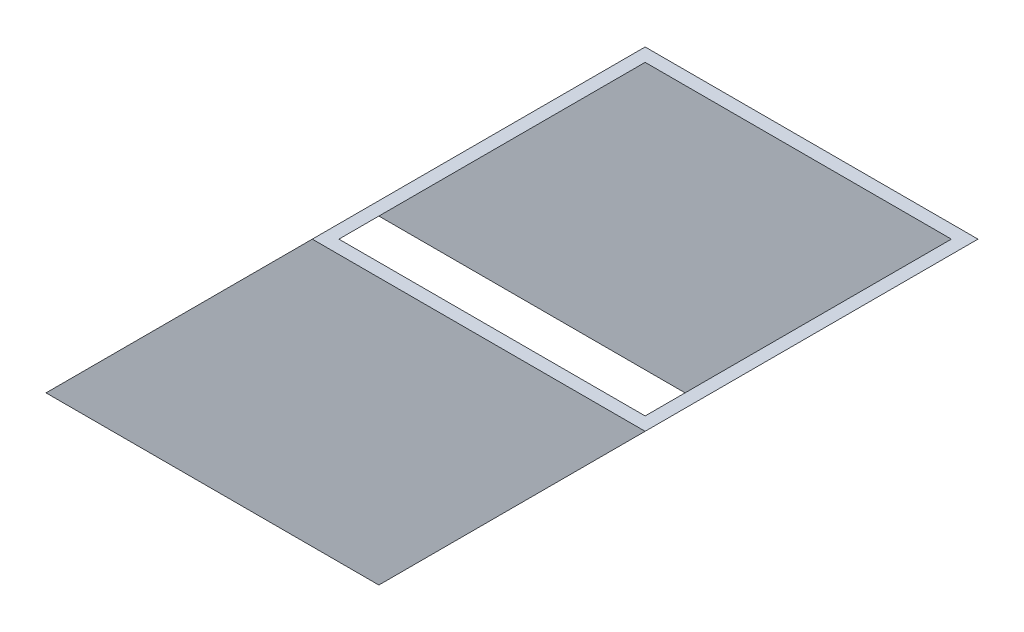
ISO-10303-21;
HEADER;
FILE_DESCRIPTION(('STEP AP214'),'2;1');
FILE_NAME('part.step','',(''),(''),'','','');
FILE_SCHEMA(('AUTOMOTIVE_DESIGN { 1 0 10303 214 1 1 1 1 }'));
ENDSEC;
DATA;
#1=APPLICATION_CONTEXT('core data for automotive mechanical design processes');
#2=APPLICATION_PROTOCOL_DEFINITION('international standard','automotive_design',2000,#1);
#3=PRODUCT_CONTEXT('',#1,'mechanical');
#4=PRODUCT('Part','Part','',(#3));
#5=PRODUCT_RELATED_PRODUCT_CATEGORY('part','',(#4));
#6=PRODUCT_DEFINITION_FORMATION('','',#4);
#7=PRODUCT_DEFINITION_CONTEXT('part definition',#1,'design');
#8=PRODUCT_DEFINITION('design','',#6,#7);
#9=PRODUCT_DEFINITION_SHAPE('','',#8);
#10=(LENGTH_UNIT() NAMED_UNIT(*) SI_UNIT(.MILLI.,.METRE.));
#11=(NAMED_UNIT(*) PLANE_ANGLE_UNIT() SI_UNIT($,.RADIAN.));
#12=(NAMED_UNIT(*) SI_UNIT($,.STERADIAN.) SOLID_ANGLE_UNIT());
#13=UNCERTAINTY_MEASURE_WITH_UNIT(LENGTH_MEASURE(1.E-05),#10,'distance_accuracy_value','');
#14=(GEOMETRIC_REPRESENTATION_CONTEXT(3) GLOBAL_UNCERTAINTY_ASSIGNED_CONTEXT((#13)) GLOBAL_UNIT_ASSIGNED_CONTEXT((#10,
#11,#12)) REPRESENTATION_CONTEXT('',''));
#15=CARTESIAN_POINT('',(0.,0.,0.));
#16=DIRECTION('',(0.,0.,1.));
#17=DIRECTION('',(1.,0.,0.));
#18=AXIS2_PLACEMENT_3D('',#15,#16,#17);
#19=CARTESIAN_POINT('',(0.,0.,0.));
#20=DIRECTION('',(0.,0.,-1.));
#21=DIRECTION('',(-1.,0.,0.));
#22=AXIS2_PLACEMENT_3D('',#19,#20,#21);
#23=PLANE('',#22);
#24=DIRECTION('',(1.,0.,0.));
#25=VECTOR('',#24,1.);
#26=CARTESIAN_POINT('',(-32.3420074349443,-70.3531598513011,0.));
#27=LINE('',#26,#25);
#28=CARTESIAN_POINT('',(-80.3420074349443,-70.3531598513011,0.));
#29=VERTEX_POINT('',#28);
#30=CARTESIAN_POINT('',(-34.3420074349443,-70.3531598513011,0.));
#31=VERTEX_POINT('',#30);
#32=EDGE_CURVE('E213',#29,#31,#27,.T.);
#33=ORIENTED_EDGE('',*,*,#32,.F.);
#34=DIRECTION('',(-0.707106781186551,-0.707106781186544,0.));
#35=VECTOR('',#34,1.);
#36=CARTESIAN_POINT('',(-40.3420074349438,-30.3531598513011,0.));
#37=LINE('',#36,#35);
#38=CARTESIAN_POINT('',(-40.3420074349438,-30.3531598513011,0.));
#39=VERTEX_POINT('',#38);
#40=EDGE_CURVE('E190',#39,#29,#37,.T.);
#41=ORIENTED_EDGE('',*,*,#40,.F.);
#42=DIRECTION('',(-1.,0.,0.));
#43=VECTOR('',#42,1.);
#44=CARTESIAN_POINT('',(-42.3420074349438,-30.3531598513011,0.));
#45=LINE('',#44,#43);
#46=CARTESIAN_POINT('',(5.65799256505616,-30.3531598513011,0.));
#47=VERTEX_POINT('',#46);
#48=EDGE_CURVE('E218',#47,#39,#45,.T.);
#49=ORIENTED_EDGE('',*,*,#48,.F.);
#50=DIRECTION('',(0.707106781186551,0.707106781186544,0.));
#51=VECTOR('',#50,1.);
#52=CARTESIAN_POINT('',(-34.3420074349443,-70.3531598513011,0.));
#53=LINE('',#52,#51);
#54=EDGE_CURVE('E201',#31,#47,#53,.T.);
#55=ORIENTED_EDGE('',*,*,#54,.F.);
#56=EDGE_LOOP('',(#33,#41,#49,#55));
#57=FACE_BOUND('',#56,.T.);
#58=ADVANCED_FACE('F39',(#57),#23,.T.);
#59=CARTESIAN_POINT('',(-82.3420074349443,-70.3531598513011,2.));
#60=DIRECTION('',(0.707106781186544,-0.707106781186551,0.));
#61=DIRECTION('',(0.707106781186551,0.707106781186544,0.));
#62=AXIS2_PLACEMENT_3D('',#59,#60,#61);
#63=PLANE('',#62);
#64=DIRECTION('',(-0.707106781186551,-0.707106781186544,0.));
#65=VECTOR('',#64,1.);
#66=CARTESIAN_POINT('',(-63.0733476476107,-51.0845000639678,-28.));
#67=LINE('',#66,#65);
#68=CARTESIAN_POINT('',(-59.1842603510847,-47.1954127674418,-28.));
#69=VERTEX_POINT('',#68);
#70=CARTESIAN_POINT('',(-63.0733476476107,-51.0845000639678,-28.));
#71=VERTEX_POINT('',#70);
#72=EDGE_CURVE('E143',#69,#71,#67,.T.);
#73=ORIENTED_EDGE('',*,*,#72,.F.);
#74=DIRECTION('',(0.,0.,-1.));
#75=VECTOR('',#74,1.);
#76=CARTESIAN_POINT('',(-59.1842603510847,-47.1954127674418,-28.));
#77=LINE('',#76,#75);
#78=CARTESIAN_POINT('',(-59.1842603510847,-47.1954127674418,-18.));
#79=VERTEX_POINT('',#78);
#80=EDGE_CURVE('E55',#79,#69,#77,.T.);
#81=ORIENTED_EDGE('',*,*,#80,.F.);
#82=DIRECTION('',(0.707106781186551,0.707106781186544,0.));
#83=VECTOR('',#82,1.);
#84=CARTESIAN_POINT('',(-59.1842603510847,-47.1954127674418,-18.));
#85=LINE('',#84,#83);
#86=CARTESIAN_POINT('',(-63.0733476476107,-51.0845000639678,-18.));
#87=VERTEX_POINT('',#86);
#88=EDGE_CURVE('E149',#87,#79,#85,.T.);
#89=ORIENTED_EDGE('',*,*,#88,.F.);
#90=DIRECTION('',(0.,0.,1.));
#91=VECTOR('',#90,1.);
#92=CARTESIAN_POINT('',(-63.0733476476107,-51.0845000639678,-18.));
#93=LINE('',#92,#91);
#94=EDGE_CURVE('E132',#71,#87,#93,.T.);
#95=ORIENTED_EDGE('',*,*,#94,.F.);
#96=EDGE_LOOP('',(#73,#81,#89,#95));
#97=FACE_BOUND('',#96,.T.);
#98=DIRECTION('',(0.,0.,-1.));
#99=VECTOR('',#98,1.);
#100=CARTESIAN_POINT('',(-42.3420074349438,-30.3531598513011,2.));
#101=LINE('',#100,#99);
#102=CARTESIAN_POINT('',(-42.3420074349438,-30.3531598513011,2.));
#103=VERTEX_POINT('',#102);
#104=CARTESIAN_POINT('',(-42.3420074349438,-30.3531598513011,-48.));
#105=VERTEX_POINT('',#104);
#106=EDGE_CURVE('E224',#103,#105,#101,.T.);
#107=ORIENTED_EDGE('',*,*,#106,.T.);
#108=DIRECTION('',(0.707106781186551,0.707106781186544,0.));
#109=VECTOR('',#108,1.);
#110=CARTESIAN_POINT('',(-42.3420074349438,-30.3531598513011,-48.));
#111=LINE('',#110,#109);
#112=CARTESIAN_POINT('',(-82.3420074349443,-70.3531598513011,-48.));
#113=VERTEX_POINT('',#112);
#114=EDGE_CURVE('E184',#113,#105,#111,.T.);
#115=ORIENTED_EDGE('',*,*,#114,.F.);
#116=DIRECTION('',(0.,0.,-1.));
#117=VECTOR('',#116,1.);
#118=CARTESIAN_POINT('',(-82.3420074349443,-70.3531598513011,2.));
#119=LINE('',#118,#117);
#120=CARTESIAN_POINT('',(-82.3420074349443,-70.3531598513011,2.));
#121=VERTEX_POINT('',#120);
#122=EDGE_CURVE('E11',#121,#113,#119,.T.);
#123=ORIENTED_EDGE('',*,*,#122,.F.);
#124=DIRECTION('',(-0.707106781186551,-0.707106781186544,0.));
#125=VECTOR('',#124,1.);
#126=CARTESIAN_POINT('',(-82.3420074349443,-70.3531598513011,2.));
#127=LINE('',#126,#125);
#128=EDGE_CURVE('E214',#103,#121,#127,.T.);
#129=ORIENTED_EDGE('',*,*,#128,.F.);
#130=EDGE_LOOP('',(#107,#115,#123,#129));
#131=FACE_BOUND('',#130,.T.);
#132=ADVANCED_FACE('F41',(#97,#131),#63,.F.);
#133=CARTESIAN_POINT('',(-32.3420074349443,-70.3531598513011,2.));
#134=DIRECTION('',(0.,1.,0.));
#135=DIRECTION('',(0.,0.,1.));
#136=AXIS2_PLACEMENT_3D('',#133,#134,#135);
#137=PLANE('',#136);
#138=DIRECTION('',(0.,0.,1.));
#139=VECTOR('',#138,1.);
#140=CARTESIAN_POINT('',(-34.3420074349443,-70.3531598513011,-46.));
#141=LINE('',#140,#139);
#142=CARTESIAN_POINT('',(-34.3420074349443,-70.3531598513011,-46.));
#143=VERTEX_POINT('',#142);
#144=EDGE_CURVE('E205',#143,#31,#141,.T.);
#145=ORIENTED_EDGE('',*,*,#144,.F.);
#146=DIRECTION('',(-1.,0.,0.));
#147=VECTOR('',#146,1.);
#148=CARTESIAN_POINT('',(-82.3420074349443,-70.3531598513011,-46.));
#149=LINE('',#148,#147);
#150=CARTESIAN_POINT('',(-80.3420074349443,-70.3531598513011,-46.));
#151=VERTEX_POINT('',#150);
#152=EDGE_CURVE('E174',#143,#151,#149,.T.);
#153=ORIENTED_EDGE('',*,*,#152,.T.);
#154=DIRECTION('',(0.,0.,1.));
#155=VECTOR('',#154,1.);
#156=CARTESIAN_POINT('',(-80.3420074349443,-70.3531598513011,-46.));
#157=LINE('',#156,#155);
#158=EDGE_CURVE('E63',#151,#29,#157,.T.);
#159=ORIENTED_EDGE('',*,*,#158,.T.);
#160=ORIENTED_EDGE('',*,*,#32,.T.);
#161=EDGE_LOOP('',(#145,#153,#159,#160));
#162=FACE_BOUND('',#161,.T.);
#163=ORIENTED_EDGE('',*,*,#122,.T.);
#164=DIRECTION('',(-1.,0.,0.));
#165=VECTOR('',#164,1.);
#166=CARTESIAN_POINT('',(-82.3420074349443,-70.3531598513011,-48.));
#167=LINE('',#166,#165);
#168=CARTESIAN_POINT('',(-32.3420074349443,-70.3531598513011,-48.));
#169=VERTEX_POINT('',#168);
#170=EDGE_CURVE('E180',#169,#113,#167,.T.);
#171=ORIENTED_EDGE('',*,*,#170,.F.);
#172=DIRECTION('',(0.,0.,-1.));
#173=VECTOR('',#172,1.);
#174=CARTESIAN_POINT('',(-32.3420074349443,-70.3531598513011,2.));
#175=LINE('',#174,#173);
#176=CARTESIAN_POINT('',(-32.3420074349443,-70.3531598513011,2.));
#177=VERTEX_POINT('',#176);
#178=EDGE_CURVE('E48',#177,#169,#175,.T.);
#179=ORIENTED_EDGE('',*,*,#178,.F.);
#180=DIRECTION('',(1.,0.,0.));
#181=VECTOR('',#180,1.);
#182=CARTESIAN_POINT('',(-32.3420074349443,-70.3531598513011,2.));
#183=LINE('',#182,#181);
#184=EDGE_CURVE('E217',#121,#177,#183,.T.);
#185=ORIENTED_EDGE('',*,*,#184,.F.);
#186=EDGE_LOOP('',(#163,#171,#179,#185));
#187=FACE_BOUND('',#186,.T.);
#188=ADVANCED_FACE('F239',(#162,#187),#137,.F.);
#189=CARTESIAN_POINT('',(7.65799256505616,-30.3531598513011,2.));
#190=DIRECTION('',(-0.707106781186544,0.707106781186551,0.));
#191=DIRECTION('',(-0.707106781186551,-0.707106781186544,0.));
#192=AXIS2_PLACEMENT_3D('',#189,#190,#191);
#193=PLANE('',#192);
#194=ORIENTED_EDGE('',*,*,#178,.T.);
#195=DIRECTION('',(-0.707106781186551,-0.707106781186544,0.));
#196=VECTOR('',#195,1.);
#197=CARTESIAN_POINT('',(-32.3420074349443,-70.3531598513011,-48.));
#198=LINE('',#197,#196);
#199=CARTESIAN_POINT('',(7.65799256505616,-30.3531598513011,-48.));
#200=VERTEX_POINT('',#199);
#201=EDGE_CURVE('E177',#200,#169,#198,.T.);
#202=ORIENTED_EDGE('',*,*,#201,.F.);
#203=DIRECTION('',(0.,0.,-1.));
#204=VECTOR('',#203,1.);
#205=CARTESIAN_POINT('',(7.65799256505616,-30.3531598513011,2.));
#206=LINE('',#205,#204);
#207=CARTESIAN_POINT('',(7.65799256505616,-30.3531598513011,2.));
#208=VERTEX_POINT('',#207);
#209=EDGE_CURVE('E229',#208,#200,#206,.T.);
#210=ORIENTED_EDGE('',*,*,#209,.F.);
#211=DIRECTION('',(0.707106781186551,0.707106781186544,0.));
#212=VECTOR('',#211,1.);
#213=CARTESIAN_POINT('',(7.65799256505616,-30.3531598513011,2.));
#214=LINE('',#213,#212);
#215=EDGE_CURVE('E220',#177,#208,#214,.T.);
#216=ORIENTED_EDGE('',*,*,#215,.F.);
#217=EDGE_LOOP('',(#194,#202,#210,#216));
#218=FACE_BOUND('',#217,.T.);
#219=ADVANCED_FACE('F236',(#218),#193,.F.);
#220=CARTESIAN_POINT('',(-42.3420074349438,-30.3531598513011,2.));
#221=DIRECTION('',(0.,-1.,0.));
#222=DIRECTION('',(0.,0.,-1.));
#223=AXIS2_PLACEMENT_3D('',#220,#221,#222);
#224=PLANE('',#223);
#225=ORIENTED_EDGE('',*,*,#209,.T.);
#226=DIRECTION('',(1.,0.,0.));
#227=VECTOR('',#226,1.);
#228=CARTESIAN_POINT('',(7.65799256505616,-30.3531598513011,-48.));
#229=LINE('',#228,#227);
#230=EDGE_CURVE('E187',#105,#200,#229,.T.);
#231=ORIENTED_EDGE('',*,*,#230,.F.);
#232=ORIENTED_EDGE('',*,*,#106,.F.);
#233=DIRECTION('',(-1.,0.,0.));
#234=VECTOR('',#233,1.);
#235=CARTESIAN_POINT('',(-42.3420074349438,-30.3531598513011,2.));
#236=LINE('',#235,#234);
#237=EDGE_CURVE('E222',#208,#103,#236,.T.);
#238=ORIENTED_EDGE('',*,*,#237,.F.);
#239=EDGE_LOOP('',(#225,#231,#232,#238));
#240=FACE_BOUND('',#239,.T.);
#241=DIRECTION('',(1.,0.,0.));
#242=VECTOR('',#241,1.);
#243=CARTESIAN_POINT('',(7.65799256505616,-30.3531598513011,-46.));
#244=LINE('',#243,#242);
#245=CARTESIAN_POINT('',(-40.3420074349438,-30.3531598513011,-46.));
#246=VERTEX_POINT('',#245);
#247=CARTESIAN_POINT('',(5.65799256505616,-30.3531598513011,-46.));
#248=VERTEX_POINT('',#247);
#249=EDGE_CURVE('E181',#246,#248,#244,.T.);
#250=ORIENTED_EDGE('',*,*,#249,.T.);
#251=DIRECTION('',(0.,0.,1.));
#252=VECTOR('',#251,1.);
#253=CARTESIAN_POINT('',(5.65799256505616,-30.3531598513011,-46.));
#254=LINE('',#253,#252);
#255=EDGE_CURVE('E210',#248,#47,#254,.T.);
#256=ORIENTED_EDGE('',*,*,#255,.T.);
#257=ORIENTED_EDGE('',*,*,#48,.T.);
#258=DIRECTION('',(0.,0.,1.));
#259=VECTOR('',#258,1.);
#260=CARTESIAN_POINT('',(-40.3420074349438,-30.3531598513011,-46.));
#261=LINE('',#260,#259);
#262=EDGE_CURVE('E199',#246,#39,#261,.T.);
#263=ORIENTED_EDGE('',*,*,#262,.F.);
#264=EDGE_LOOP('',(#250,#256,#257,#263));
#265=FACE_BOUND('',#264,.T.);
#266=ADVANCED_FACE('F247',(#240,#265),#224,.F.);
#267=CARTESIAN_POINT('',(0.,0.,2.));
#268=DIRECTION('',(0.,0.,-1.));
#269=DIRECTION('',(-1.,0.,0.));
#270=AXIS2_PLACEMENT_3D('',#267,#268,#269);
#271=PLANE('',#270);
#272=ORIENTED_EDGE('',*,*,#128,.T.);
#273=ORIENTED_EDGE('',*,*,#184,.T.);
#274=ORIENTED_EDGE('',*,*,#215,.T.);
#275=ORIENTED_EDGE('',*,*,#237,.T.);
#276=EDGE_LOOP('',(#272,#273,#274,#275));
#277=FACE_BOUND('',#276,.T.);
#278=ADVANCED_FACE('F252',(#277),#271,.F.);
#279=CARTESIAN_POINT('',(-34.3420074349443,-70.3531598513011,-46.));
#280=DIRECTION('',(0.707106781186544,-0.707106781186551,0.));
#281=DIRECTION('',(0.707106781186551,0.707106781186544,0.));
#282=AXIS2_PLACEMENT_3D('',#279,#280,#281);
#283=PLANE('',#282);
#284=ORIENTED_EDGE('',*,*,#54,.T.);
#285=ORIENTED_EDGE('',*,*,#255,.F.);
#286=DIRECTION('',(0.707106781186551,0.707106781186544,0.));
#287=VECTOR('',#286,1.);
#288=CARTESIAN_POINT('',(-34.3420074349443,-70.3531598513011,-46.));
#289=LINE('',#288,#287);
#290=EDGE_CURVE('E202',#143,#248,#289,.T.);
#291=ORIENTED_EDGE('',*,*,#290,.F.);
#292=ORIENTED_EDGE('',*,*,#144,.T.);
#293=EDGE_LOOP('',(#284,#285,#291,#292));
#294=FACE_BOUND('',#293,.T.);
#295=ADVANCED_FACE('F286',(#294),#283,.F.);
#296=CARTESIAN_POINT('',(-40.3420074349438,-30.3531598513011,-46.));
#297=DIRECTION('',(-0.707106781186544,0.707106781186551,0.));
#298=DIRECTION('',(-0.707106781186551,-0.707106781186544,0.));
#299=AXIS2_PLACEMENT_3D('',#296,#297,#298);
#300=PLANE('',#299);
#301=CARTESIAN_POINT('',(-60.1288039993477,-50.1399564157048,-21.25));
#302=DIRECTION('',(-0.707106781186544,0.707106781186551,0.));
#303=DIRECTION('',(-0.707106781186551,-0.707106781186544,0.));
#304=AXIS2_PLACEMENT_3D('',#301,#302,#303);
#305=CIRCLE('',#304,1.5);
#306=CARTESIAN_POINT('',(-61.1894641711275,-51.2006165874846,-21.25));
#307=VERTEX_POINT('',#306);
#308=EDGE_CURVE('E171',#307,#307,#305,.F.);
#309=ORIENTED_EDGE('',*,*,#308,.F.);
#310=EDGE_LOOP('',(#309));
#311=FACE_BOUND('',#310,.T.);
#312=CARTESIAN_POINT('',(-60.1288039993477,-50.1399564157048,-24.75));
#313=DIRECTION('',(-0.707106781186544,0.707106781186551,0.));
#314=DIRECTION('',(-0.707106781186551,-0.707106781186544,0.));
#315=AXIS2_PLACEMENT_3D('',#312,#313,#314);
#316=CIRCLE('',#315,1.5);
#317=CARTESIAN_POINT('',(-61.1894641711275,-51.2006165874846,-24.75));
#318=VERTEX_POINT('',#317);
#319=EDGE_CURVE('E170',#318,#318,#316,.F.);
#320=ORIENTED_EDGE('',*,*,#319,.F.);
#321=EDGE_LOOP('',(#320));
#322=FACE_BOUND('',#321,.T.);
#323=ORIENTED_EDGE('',*,*,#40,.T.);
#324=ORIENTED_EDGE('',*,*,#158,.F.);
#325=DIRECTION('',(-0.707106781186551,-0.707106781186544,0.));
#326=VECTOR('',#325,1.);
#327=CARTESIAN_POINT('',(-40.3420074349438,-30.3531598513011,-46.));
#328=LINE('',#327,#326);
#329=EDGE_CURVE('E194',#246,#151,#328,.T.);
#330=ORIENTED_EDGE('',*,*,#329,.F.);
#331=ORIENTED_EDGE('',*,*,#262,.T.);
#332=EDGE_LOOP('',(#323,#324,#330,#331));
#333=FACE_BOUND('',#332,.T.);
#334=ADVANCED_FACE('F290',(#311,#322,#333),#300,.F.);
#335=CARTESIAN_POINT('',(0.,0.,-46.));
#336=DIRECTION('',(0.,0.,1.));
#337=DIRECTION('',(1.,0.,0.));
#338=AXIS2_PLACEMENT_3D('',#335,#336,#337);
#339=PLANE('',#338);
#340=ORIENTED_EDGE('',*,*,#290,.T.);
#341=ORIENTED_EDGE('',*,*,#249,.F.);
#342=ORIENTED_EDGE('',*,*,#329,.T.);
#343=ORIENTED_EDGE('',*,*,#152,.F.);
#344=EDGE_LOOP('',(#340,#341,#342,#343));
#345=FACE_BOUND('',#344,.T.);
#346=ADVANCED_FACE('F295',(#345),#339,.T.);
#347=CARTESIAN_POINT('',(0.,0.,-48.));
#348=DIRECTION('',(0.,0.,1.));
#349=DIRECTION('',(1.,0.,0.));
#350=AXIS2_PLACEMENT_3D('',#347,#348,#349);
#351=PLANE('',#350);
#352=ORIENTED_EDGE('',*,*,#201,.T.);
#353=ORIENTED_EDGE('',*,*,#170,.T.);
#354=ORIENTED_EDGE('',*,*,#114,.T.);
#355=ORIENTED_EDGE('',*,*,#230,.T.);
#356=EDGE_LOOP('',(#352,#353,#354,#355));
#357=FACE_BOUND('',#356,.T.);
#358=ADVANCED_FACE('F243',(#357),#351,.F.);
#359=CARTESIAN_POINT('',(-57.1288039993477,-53.1399564157048,-24.75));
#360=DIRECTION('',(-0.707106781186544,0.707106781186551,0.));
#361=DIRECTION('',(-0.707106781186551,-0.707106781186544,0.));
#362=AXIS2_PLACEMENT_3D('',#359,#360,#361);
#363=CYLINDRICAL_SURFACE('',#362,1.5);
#364=CARTESIAN_POINT('',(-60.4216972181612,-49.8470631968913,-24.75));
#365=DIRECTION('',(0.707106781186544,-0.707106781186551,0.));
#366=DIRECTION('',(0.707106781186551,0.707106781186544,0.));
#367=AXIS2_PLACEMENT_3D('',#364,#365,#366);
#368=CIRCLE('',#367,1.5);
#369=CARTESIAN_POINT('',(-59.3610370463813,-48.7864030251115,-24.75));
#370=VERTEX_POINT('',#369);
#371=EDGE_CURVE('E167',#370,#370,#368,.F.);
#372=ORIENTED_EDGE('',*,*,#371,.T.);
#373=EDGE_LOOP('',(#372));
#374=FACE_BOUND('',#373,.T.);
#375=ORIENTED_EDGE('',*,*,#319,.T.);
#376=EDGE_LOOP('',(#375));
#377=FACE_BOUND('',#376,.T.);
#378=ADVANCED_FACE('F304',(#374,#377),#363,.F.);
#379=CARTESIAN_POINT('',(-57.1288039993477,-53.1399564157048,-21.25));
#380=DIRECTION('',(-0.707106781186544,0.707106781186551,0.));
#381=DIRECTION('',(-0.707106781186551,-0.707106781186544,0.));
#382=AXIS2_PLACEMENT_3D('',#379,#380,#381);
#383=CYLINDRICAL_SURFACE('',#382,1.5);
#384=CARTESIAN_POINT('',(-60.4216972181612,-49.8470631968913,-21.25));
#385=DIRECTION('',(0.707106781186544,-0.707106781186551,0.));
#386=DIRECTION('',(0.707106781186551,0.707106781186544,0.));
#387=AXIS2_PLACEMENT_3D('',#384,#385,#386);
#388=CIRCLE('',#387,1.5);
#389=CARTESIAN_POINT('',(-59.3610370463813,-48.7864030251115,-21.25));
#390=VERTEX_POINT('',#389);
#391=EDGE_CURVE('E43',#390,#390,#388,.F.);
#392=ORIENTED_EDGE('',*,*,#391,.T.);
#393=EDGE_LOOP('',(#392));
#394=FACE_BOUND('',#393,.T.);
#395=ORIENTED_EDGE('',*,*,#308,.T.);
#396=EDGE_LOOP('',(#395));
#397=FACE_BOUND('',#396,.T.);
#398=ADVANCED_FACE('F356',(#394,#397),#383,.F.);
#399=CARTESIAN_POINT('',(-5.28731701063459,5.28731701063465,0.));
#400=DIRECTION('',(0.707106781186544,-0.707106781186551,0.));
#401=DIRECTION('',(0.707106781186551,0.707106781186544,0.));
#402=AXIS2_PLACEMENT_3D('',#399,#400,#401);
#403=PLANE('',#402);
#404=ORIENTED_EDGE('',*,*,#391,.F.);
#405=EDGE_LOOP('',(#404));
#406=FACE_BOUND('',#405,.T.);
#407=DIRECTION('',(0.,0.,-1.));
#408=VECTOR('',#407,1.);
#409=CARTESIAN_POINT('',(-59.1842603510847,-48.6096263298149,-28.));
#410=LINE('',#409,#408);
#411=CARTESIAN_POINT('',(-59.1842603510847,-48.6096263298149,-19.));
#412=VERTEX_POINT('',#411);
#413=CARTESIAN_POINT('',(-59.1842603510847,-48.6096263298149,-27.));
#414=VERTEX_POINT('',#413);
#415=EDGE_CURVE('E151',#412,#414,#410,.T.);
#416=ORIENTED_EDGE('',*,*,#415,.T.);
#417=DIRECTION('',(-0.707106781186551,-0.707106781186544,0.));
#418=VECTOR('',#417,1.);
#419=CARTESIAN_POINT('',(-62.3662408664242,-51.7916068451543,-27.));
#420=LINE('',#419,#418);
#421=CARTESIAN_POINT('',(-61.6591340852376,-51.0845000639678,-27.));
#422=VERTEX_POINT('',#421);
#423=EDGE_CURVE('E162',#414,#422,#420,.T.);
#424=ORIENTED_EDGE('',*,*,#423,.T.);
#425=DIRECTION('',(0.,0.,1.));
#426=VECTOR('',#425,1.);
#427=CARTESIAN_POINT('',(-61.6591340852376,-51.0845000639678,-18.));
#428=LINE('',#427,#426);
#429=CARTESIAN_POINT('',(-61.6591340852376,-51.0845000639678,-19.));
#430=VERTEX_POINT('',#429);
#431=EDGE_CURVE('E135',#422,#430,#428,.T.);
#432=ORIENTED_EDGE('',*,*,#431,.T.);
#433=DIRECTION('',(0.707106781186551,0.707106781186544,0.));
#434=VECTOR('',#433,1.);
#435=CARTESIAN_POINT('',(-58.4771535698981,-47.9025195486283,-19.));
#436=LINE('',#435,#434);
#437=EDGE_CURVE('E157',#430,#412,#436,.T.);
#438=ORIENTED_EDGE('',*,*,#437,.T.);
#439=EDGE_LOOP('',(#416,#424,#432,#438));
#440=FACE_BOUND('',#439,.T.);
#441=ORIENTED_EDGE('',*,*,#371,.F.);
#442=EDGE_LOOP('',(#441));
#443=FACE_BOUND('',#442,.T.);
#444=ADVANCED_FACE('F360',(#406,#440,#443),#403,.F.);
#445=CARTESIAN_POINT('',(-59.1842603510847,-47.1954127674418,-28.));
#446=DIRECTION('',(1.,0.,0.));
#447=DIRECTION('',(0.,1.,0.));
#448=AXIS2_PLACEMENT_3D('',#445,#446,#447);
#449=PLANE('',#448);
#450=ORIENTED_EDGE('',*,*,#80,.T.);
#451=DIRECTION('',(0.,0.816496580927725,-0.577350269189627));
#452=VECTOR('',#451,1.);
#453=CARTESIAN_POINT('',(-59.1842603510847,-47.1954127674418,-28.));
#454=LINE('',#453,#452);
#455=EDGE_CURVE('E140',#414,#69,#454,.T.);
#456=ORIENTED_EDGE('',*,*,#455,.F.);
#457=ORIENTED_EDGE('',*,*,#415,.F.);
#458=DIRECTION('',(0.,0.816496580927726,0.577350269189626));
#459=VECTOR('',#458,1.);
#460=CARTESIAN_POINT('',(-59.1842603510847,-47.1954127674418,-18.));
#461=LINE('',#460,#459);
#462=EDGE_CURVE('E155',#412,#79,#461,.T.);
#463=ORIENTED_EDGE('',*,*,#462,.T.);
#464=EDGE_LOOP('',(#450,#456,#457,#463));
#465=FACE_BOUND('',#464,.T.);
#466=ADVANCED_FACE('F365',(#465),#449,.F.);
#467=CARTESIAN_POINT('',(-59.1842603510847,-47.1954127674418,-18.));
#468=DIRECTION('',(0.499999999999999,-0.500000000000003,0.707106781186546));
#469=DIRECTION('',(0.,-0.816496580927724,-0.577350269189629));
#470=AXIS2_PLACEMENT_3D('',#467,#468,#469);
#471=PLANE('',#470);
#472=ORIENTED_EDGE('',*,*,#88,.T.);
#473=ORIENTED_EDGE('',*,*,#462,.F.);
#474=ORIENTED_EDGE('',*,*,#437,.F.);
#475=DIRECTION('',(-0.816496580927725,0.,0.577350269189627));
#476=VECTOR('',#475,1.);
#477=CARTESIAN_POINT('',(-63.0733476476107,-51.0845000639678,-18.));
#478=LINE('',#477,#476);
#479=EDGE_CURVE('E139',#430,#87,#478,.T.);
#480=ORIENTED_EDGE('',*,*,#479,.T.);
#481=EDGE_LOOP('',(#472,#473,#474,#480));
#482=FACE_BOUND('',#481,.T.);
#483=ADVANCED_FACE('F362',(#482),#471,.F.);
#484=CARTESIAN_POINT('',(-63.0733476476107,-51.0845000639678,-18.));
#485=DIRECTION('',(0.,-1.,0.));
#486=DIRECTION('',(1.,0.,0.));
#487=AXIS2_PLACEMENT_3D('',#484,#485,#486);
#488=PLANE('',#487);
#489=ORIENTED_EDGE('',*,*,#94,.T.);
#490=ORIENTED_EDGE('',*,*,#479,.F.);
#491=ORIENTED_EDGE('',*,*,#431,.F.);
#492=DIRECTION('',(-0.816496580927726,0.,-0.577350269189627));
#493=VECTOR('',#492,1.);
#494=CARTESIAN_POINT('',(-63.0733476476107,-51.0845000639678,-28.));
#495=LINE('',#494,#493);
#496=EDGE_CURVE('E128',#422,#71,#495,.T.);
#497=ORIENTED_EDGE('',*,*,#496,.T.);
#498=EDGE_LOOP('',(#489,#490,#491,#497));
#499=FACE_BOUND('',#498,.T.);
#500=ADVANCED_FACE('F130',(#499),#488,.F.);
#501=CARTESIAN_POINT('',(-63.0733476476107,-51.0845000639678,-28.));
#502=DIRECTION('',(0.499999999999998,-0.500000000000004,-0.707106781186546));
#503=DIRECTION('',(0.,0.816496580927724,-0.577350269189629));
#504=AXIS2_PLACEMENT_3D('',#501,#502,#503);
#505=PLANE('',#504);
#506=ORIENTED_EDGE('',*,*,#72,.T.);
#507=ORIENTED_EDGE('',*,*,#496,.F.);
#508=ORIENTED_EDGE('',*,*,#423,.F.);
#509=ORIENTED_EDGE('',*,*,#455,.T.);
#510=EDGE_LOOP('',(#506,#507,#508,#509));
#511=FACE_BOUND('',#510,.T.);
#512=ADVANCED_FACE('F144',(#511),#505,.F.);
#513=CLOSED_SHELL('',(#58,#132,#188,#219,#266,#278,#295,#334,#346,#358,#378,#398,#444,#466,#483,
#500,#512));
#514=MANIFOLD_SOLID_BREP('B2',#513);
#515=ADVANCED_BREP_SHAPE_REPRESENTATION('',(#18,#514),#14);
#516=SHAPE_DEFINITION_REPRESENTATION(#9,#515);
ENDSEC;
END-ISO-10303-21;
